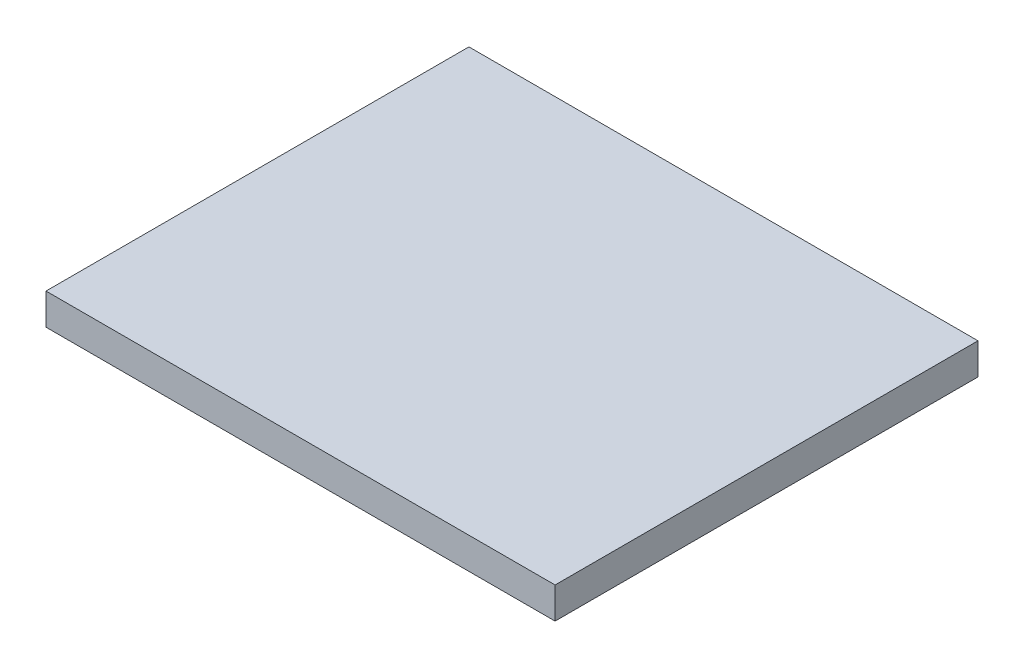
ISO-10303-21;
HEADER;
FILE_DESCRIPTION(('STEP AP214'),'2;1');
FILE_NAME('part.step','',(''),(''),'','','');
FILE_SCHEMA(('AUTOMOTIVE_DESIGN { 1 0 10303 214 1 1 1 1 }'));
ENDSEC;
DATA;
#1=APPLICATION_CONTEXT('core data for automotive mechanical design processes');
#2=APPLICATION_PROTOCOL_DEFINITION('international standard','automotive_design',2000,#1);
#3=PRODUCT_CONTEXT('',#1,'mechanical');
#4=PRODUCT('Part','Part','',(#3));
#5=PRODUCT_RELATED_PRODUCT_CATEGORY('part','',(#4));
#6=PRODUCT_DEFINITION_FORMATION('','',#4);
#7=PRODUCT_DEFINITION_CONTEXT('part definition',#1,'design');
#8=PRODUCT_DEFINITION('design','',#6,#7);
#9=PRODUCT_DEFINITION_SHAPE('','',#8);
#10=(LENGTH_UNIT() NAMED_UNIT(*) SI_UNIT(.MILLI.,.METRE.));
#11=(NAMED_UNIT(*) PLANE_ANGLE_UNIT() SI_UNIT($,.RADIAN.));
#12=(NAMED_UNIT(*) SI_UNIT($,.STERADIAN.) SOLID_ANGLE_UNIT());
#13=UNCERTAINTY_MEASURE_WITH_UNIT(LENGTH_MEASURE(1.E-05),#10,'distance_accuracy_value','');
#14=(GEOMETRIC_REPRESENTATION_CONTEXT(3) GLOBAL_UNCERTAINTY_ASSIGNED_CONTEXT((#13)) GLOBAL_UNIT_ASSIGNED_CONTEXT((#10,
#11,#12)) REPRESENTATION_CONTEXT('',''));
#15=CARTESIAN_POINT('',(0.,0.,0.));
#16=DIRECTION('',(0.,0.,1.));
#17=DIRECTION('',(1.,0.,0.));
#18=AXIS2_PLACEMENT_3D('',#15,#16,#17);
#19=CARTESIAN_POINT('',(-206.375,12.7,171.45));
#20=DIRECTION('',(1.,0.,0.));
#21=DIRECTION('',(0.,0.,-1.));
#22=AXIS2_PLACEMENT_3D('',#19,#20,#21);
#23=PLANE('',#22);
#24=DIRECTION('',(0.,0.,1.));
#25=VECTOR('',#24,1.);
#26=CARTESIAN_POINT('',(-206.375,-12.7,171.45));
#27=LINE('',#26,#25);
#28=CARTESIAN_POINT('',(-206.375,-12.7,-171.45));
#29=VERTEX_POINT('',#28);
#30=CARTESIAN_POINT('',(-206.375,-12.7,171.45));
#31=VERTEX_POINT('',#30);
#32=EDGE_CURVE('E98',#29,#31,#27,.T.);
#33=ORIENTED_EDGE('',*,*,#32,.T.);
#34=DIRECTION('',(0.,-1.,0.));
#35=VECTOR('',#34,1.);
#36=CARTESIAN_POINT('',(-206.375,12.7,171.45));
#37=LINE('',#36,#35);
#38=CARTESIAN_POINT('',(-206.375,12.7,171.45));
#39=VERTEX_POINT('',#38);
#40=EDGE_CURVE('E11',#39,#31,#37,.T.);
#41=ORIENTED_EDGE('',*,*,#40,.F.);
#42=DIRECTION('',(0.,0.,1.));
#43=VECTOR('',#42,1.);
#44=CARTESIAN_POINT('',(-206.375,12.7,171.45));
#45=LINE('',#44,#43);
#46=CARTESIAN_POINT('',(-206.375,12.7,-171.45));
#47=VERTEX_POINT('',#46);
#48=EDGE_CURVE('E86',#47,#39,#45,.T.);
#49=ORIENTED_EDGE('',*,*,#48,.F.);
#50=DIRECTION('',(0.,-1.,0.));
#51=VECTOR('',#50,1.);
#52=CARTESIAN_POINT('',(-206.375,12.7,-171.45));
#53=LINE('',#52,#51);
#54=EDGE_CURVE('E94',#47,#29,#53,.T.);
#55=ORIENTED_EDGE('',*,*,#54,.T.);
#56=EDGE_LOOP('',(#33,#41,#49,#55));
#57=FACE_BOUND('',#56,.T.);
#58=ADVANCED_FACE('F35',(#57),#23,.F.);
#59=CARTESIAN_POINT('',(206.375,12.7,171.45));
#60=DIRECTION('',(0.,0.,-1.));
#61=DIRECTION('',(-1.,0.,0.));
#62=AXIS2_PLACEMENT_3D('',#59,#60,#61);
#63=PLANE('',#62);
#64=DIRECTION('',(1.,0.,0.));
#65=VECTOR('',#64,1.);
#66=CARTESIAN_POINT('',(206.375,-12.7,171.45));
#67=LINE('',#66,#65);
#68=CARTESIAN_POINT('',(206.375,-12.7,171.45));
#69=VERTEX_POINT('',#68);
#70=EDGE_CURVE('E90',#31,#69,#67,.T.);
#71=ORIENTED_EDGE('',*,*,#70,.T.);
#72=DIRECTION('',(0.,-1.,0.));
#73=VECTOR('',#72,1.);
#74=CARTESIAN_POINT('',(206.375,12.7,171.45));
#75=LINE('',#74,#73);
#76=CARTESIAN_POINT('',(206.375,12.7,171.45));
#77=VERTEX_POINT('',#76);
#78=EDGE_CURVE('E43',#77,#69,#75,.T.);
#79=ORIENTED_EDGE('',*,*,#78,.F.);
#80=DIRECTION('',(1.,0.,0.));
#81=VECTOR('',#80,1.);
#82=CARTESIAN_POINT('',(206.375,12.7,171.45));
#83=LINE('',#82,#81);
#84=EDGE_CURVE('E81',#39,#77,#83,.T.);
#85=ORIENTED_EDGE('',*,*,#84,.F.);
#86=ORIENTED_EDGE('',*,*,#40,.T.);
#87=EDGE_LOOP('',(#71,#79,#85,#86));
#88=FACE_BOUND('',#87,.T.);
#89=ADVANCED_FACE('F89',(#88),#63,.F.);
#90=CARTESIAN_POINT('',(206.375,12.7,171.45));
#91=DIRECTION('',(-1.,0.,0.));
#92=DIRECTION('',(0.,0.,1.));
#93=AXIS2_PLACEMENT_3D('',#90,#91,#92);
#94=PLANE('',#93);
#95=DIRECTION('',(0.,0.,-1.));
#96=VECTOR('',#95,1.);
#97=CARTESIAN_POINT('',(206.375,-12.7,171.45));
#98=LINE('',#97,#96);
#99=CARTESIAN_POINT('',(206.375,-12.7,-171.45));
#100=VERTEX_POINT('',#99);
#101=EDGE_CURVE('E68',#69,#100,#98,.T.);
#102=ORIENTED_EDGE('',*,*,#101,.T.);
#103=DIRECTION('',(0.,-1.,0.));
#104=VECTOR('',#103,1.);
#105=CARTESIAN_POINT('',(206.375,12.7,-171.45));
#106=LINE('',#105,#104);
#107=CARTESIAN_POINT('',(206.375,12.7,-171.45));
#108=VERTEX_POINT('',#107);
#109=EDGE_CURVE('E91',#108,#100,#106,.T.);
#110=ORIENTED_EDGE('',*,*,#109,.F.);
#111=DIRECTION('',(0.,0.,-1.));
#112=VECTOR('',#111,1.);
#113=CARTESIAN_POINT('',(206.375,12.7,171.45));
#114=LINE('',#113,#112);
#115=EDGE_CURVE('E84',#77,#108,#114,.T.);
#116=ORIENTED_EDGE('',*,*,#115,.F.);
#117=ORIENTED_EDGE('',*,*,#78,.T.);
#118=EDGE_LOOP('',(#102,#110,#116,#117));
#119=FACE_BOUND('',#118,.T.);
#120=ADVANCED_FACE('F92',(#119),#94,.F.);
#121=CARTESIAN_POINT('',(206.375,12.7,-171.45));
#122=DIRECTION('',(0.,0.,1.));
#123=DIRECTION('',(1.,0.,0.));
#124=AXIS2_PLACEMENT_3D('',#121,#122,#123);
#125=PLANE('',#124);
#126=DIRECTION('',(-1.,0.,0.));
#127=VECTOR('',#126,1.);
#128=CARTESIAN_POINT('',(206.375,-12.7,-171.45));
#129=LINE('',#128,#127);
#130=EDGE_CURVE('E74',#100,#29,#129,.T.);
#131=ORIENTED_EDGE('',*,*,#130,.T.);
#132=ORIENTED_EDGE('',*,*,#54,.F.);
#133=DIRECTION('',(-1.,0.,0.));
#134=VECTOR('',#133,1.);
#135=CARTESIAN_POINT('',(206.375,12.7,-171.45));
#136=LINE('',#135,#134);
#137=EDGE_CURVE('E51',#108,#47,#136,.T.);
#138=ORIENTED_EDGE('',*,*,#137,.F.);
#139=ORIENTED_EDGE('',*,*,#109,.T.);
#140=EDGE_LOOP('',(#131,#132,#138,#139));
#141=FACE_BOUND('',#140,.T.);
#142=ADVANCED_FACE('F105',(#141),#125,.F.);
#143=CARTESIAN_POINT('',(0.,12.7,0.));
#144=DIRECTION('',(0.,1.,0.));
#145=DIRECTION('',(0.,0.,1.));
#146=AXIS2_PLACEMENT_3D('',#143,#144,#145);
#147=PLANE('',#146);
#148=ORIENTED_EDGE('',*,*,#48,.T.);
#149=ORIENTED_EDGE('',*,*,#84,.T.);
#150=ORIENTED_EDGE('',*,*,#115,.T.);
#151=ORIENTED_EDGE('',*,*,#137,.T.);
#152=EDGE_LOOP('',(#148,#149,#150,#151));
#153=FACE_BOUND('',#152,.T.);
#154=ADVANCED_FACE('F82',(#153),#147,.T.);
#155=CARTESIAN_POINT('',(0.,-12.7,0.));
#156=DIRECTION('',(0.,1.,0.));
#157=DIRECTION('',(0.,0.,1.));
#158=AXIS2_PLACEMENT_3D('',#155,#156,#157);
#159=PLANE('',#158);
#160=ORIENTED_EDGE('',*,*,#32,.F.);
#161=ORIENTED_EDGE('',*,*,#130,.F.);
#162=ORIENTED_EDGE('',*,*,#101,.F.);
#163=ORIENTED_EDGE('',*,*,#70,.F.);
#164=EDGE_LOOP('',(#160,#161,#162,#163));
#165=FACE_BOUND('',#164,.T.);
#166=ADVANCED_FACE('F108',(#165),#159,.F.);
#167=CLOSED_SHELL('',(#58,#89,#120,#142,#154,#166));
#168=MANIFOLD_SOLID_BREP('B2',#167);
#169=ADVANCED_BREP_SHAPE_REPRESENTATION('',(#18,#168),#14);
#170=SHAPE_DEFINITION_REPRESENTATION(#9,#169);
ENDSEC;
END-ISO-10303-21;
